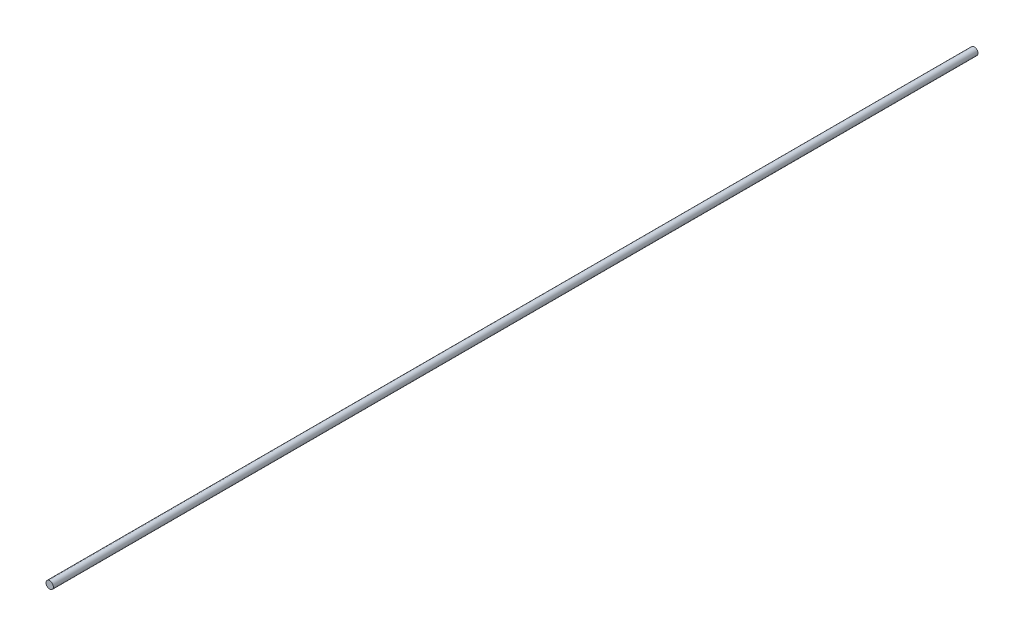
ISO-10303-21;
HEADER;
FILE_DESCRIPTION(('STEP AP214'),'2;1');
FILE_NAME('part.step','',(''),(''),'','','');
FILE_SCHEMA(('AUTOMOTIVE_DESIGN { 1 0 10303 214 1 1 1 1 }'));
ENDSEC;
DATA;
#1=APPLICATION_CONTEXT('core data for automotive mechanical design processes');
#2=APPLICATION_PROTOCOL_DEFINITION('international standard','automotive_design',2000,#1);
#3=PRODUCT_CONTEXT('',#1,'mechanical');
#4=PRODUCT('Part','Part','',(#3));
#5=PRODUCT_RELATED_PRODUCT_CATEGORY('part','',(#4));
#6=PRODUCT_DEFINITION_FORMATION('','',#4);
#7=PRODUCT_DEFINITION_CONTEXT('part definition',#1,'design');
#8=PRODUCT_DEFINITION('design','',#6,#7);
#9=PRODUCT_DEFINITION_SHAPE('','',#8);
#10=(LENGTH_UNIT() NAMED_UNIT(*) SI_UNIT(.MILLI.,.METRE.));
#11=(NAMED_UNIT(*) PLANE_ANGLE_UNIT() SI_UNIT($,.RADIAN.));
#12=(NAMED_UNIT(*) SI_UNIT($,.STERADIAN.) SOLID_ANGLE_UNIT());
#13=UNCERTAINTY_MEASURE_WITH_UNIT(LENGTH_MEASURE(1.E-05),#10,'distance_accuracy_value','');
#14=(GEOMETRIC_REPRESENTATION_CONTEXT(3) GLOBAL_UNCERTAINTY_ASSIGNED_CONTEXT((#13)) GLOBAL_UNIT_ASSIGNED_CONTEXT((#10,
#11,#12)) REPRESENTATION_CONTEXT('',''));
#15=CARTESIAN_POINT('',(0.,0.,0.));
#16=DIRECTION('',(0.,0.,1.));
#17=DIRECTION('',(1.,0.,0.));
#18=AXIS2_PLACEMENT_3D('',#15,#16,#17);
#19=CARTESIAN_POINT('',(0.,0.,1000.));
#20=DIRECTION('',(0.,0.,-1.));
#21=DIRECTION('',(-1.,0.,0.));
#22=AXIS2_PLACEMENT_3D('',#19,#20,#21);
#23=CYLINDRICAL_SURFACE('',#22,4.);
#24=CARTESIAN_POINT('',(0.,0.,1000.));
#25=DIRECTION('',(0.,0.,1.));
#26=DIRECTION('',(1.,0.,0.));
#27=AXIS2_PLACEMENT_3D('',#24,#25,#26);
#28=CIRCLE('',#27,4.);
#29=CARTESIAN_POINT('',(4.,0.,1000.));
#30=VERTEX_POINT('',#29);
#31=EDGE_CURVE('E10',#30,#30,#28,.T.);
#32=ORIENTED_EDGE('',*,*,#31,.F.);
#33=EDGE_LOOP('',(#32));
#34=FACE_BOUND('',#33,.T.);
#35=CARTESIAN_POINT('',(0.,0.,0.));
#36=DIRECTION('',(0.,0.,1.));
#37=DIRECTION('',(1.,0.,0.));
#38=AXIS2_PLACEMENT_3D('',#35,#36,#37);
#39=CIRCLE('',#38,4.);
#40=CARTESIAN_POINT('',(4.,0.,0.));
#41=VERTEX_POINT('',#40);
#42=EDGE_CURVE('E40',#41,#41,#39,.T.);
#43=ORIENTED_EDGE('',*,*,#42,.T.);
#44=EDGE_LOOP('',(#43));
#45=FACE_BOUND('',#44,.T.);
#46=ADVANCED_FACE('F37',(#34,#45),#23,.T.);
#47=CARTESIAN_POINT('',(0.,0.,1000.));
#48=DIRECTION('',(0.,0.,1.));
#49=DIRECTION('',(1.,0.,0.));
#50=AXIS2_PLACEMENT_3D('',#47,#48,#49);
#51=PLANE('',#50);
#52=ORIENTED_EDGE('',*,*,#31,.T.);
#53=EDGE_LOOP('',(#52));
#54=FACE_BOUND('',#53,.T.);
#55=ADVANCED_FACE('F54',(#54),#51,.T.);
#56=CARTESIAN_POINT('',(0.,0.,0.));
#57=DIRECTION('',(0.,0.,1.));
#58=DIRECTION('',(1.,0.,0.));
#59=AXIS2_PLACEMENT_3D('',#56,#57,#58);
#60=PLANE('',#59);
#61=ORIENTED_EDGE('',*,*,#42,.F.);
#62=EDGE_LOOP('',(#61));
#63=FACE_BOUND('',#62,.T.);
#64=ADVANCED_FACE('F52',(#63),#60,.F.);
#65=CLOSED_SHELL('',(#46,#55,#64));
#66=MANIFOLD_SOLID_BREP('B2',#65);
#67=ADVANCED_BREP_SHAPE_REPRESENTATION('',(#18,#66),#14);
#68=SHAPE_DEFINITION_REPRESENTATION(#9,#67);
ENDSEC;
END-ISO-10303-21;
